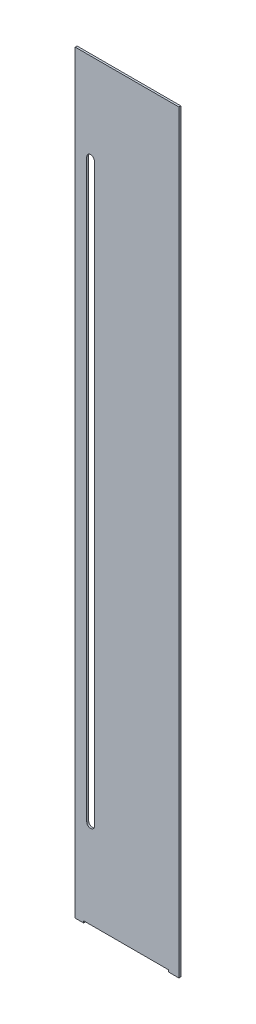
ISO-10303-21;
HEADER;
FILE_DESCRIPTION(('STEP AP214'),'2;1');
FILE_NAME('part.step','',(''),(''),'','','');
FILE_SCHEMA(('AUTOMOTIVE_DESIGN { 1 0 10303 214 1 1 1 1 }'));
ENDSEC;
DATA;
#1=APPLICATION_CONTEXT('core data for automotive mechanical design processes');
#2=APPLICATION_PROTOCOL_DEFINITION('international standard','automotive_design',2000,#1);
#3=PRODUCT_CONTEXT('',#1,'mechanical');
#4=PRODUCT('Part','Part','',(#3));
#5=PRODUCT_RELATED_PRODUCT_CATEGORY('part','',(#4));
#6=PRODUCT_DEFINITION_FORMATION('','',#4);
#7=PRODUCT_DEFINITION_CONTEXT('part definition',#1,'design');
#8=PRODUCT_DEFINITION('design','',#6,#7);
#9=PRODUCT_DEFINITION_SHAPE('','',#8);
#10=(LENGTH_UNIT() NAMED_UNIT(*) SI_UNIT(.MILLI.,.METRE.));
#11=(NAMED_UNIT(*) PLANE_ANGLE_UNIT() SI_UNIT($,.RADIAN.));
#12=(NAMED_UNIT(*) SI_UNIT($,.STERADIAN.) SOLID_ANGLE_UNIT());
#13=UNCERTAINTY_MEASURE_WITH_UNIT(LENGTH_MEASURE(1.E-05),#10,'distance_accuracy_value','');
#14=(GEOMETRIC_REPRESENTATION_CONTEXT(3) GLOBAL_UNCERTAINTY_ASSIGNED_CONTEXT((#13)) GLOBAL_UNIT_ASSIGNED_CONTEXT((#10,
#11,#12)) REPRESENTATION_CONTEXT('',''));
#15=CARTESIAN_POINT('',(0.,0.,0.));
#16=DIRECTION('',(0.,0.,1.));
#17=DIRECTION('',(1.,0.,0.));
#18=AXIS2_PLACEMENT_3D('',#15,#16,#17);
#19=CARTESIAN_POINT('',(-135.,-982.500000000002,5.));
#20=DIRECTION('',(0.,1.,0.));
#21=DIRECTION('',(0.,0.,1.));
#22=AXIS2_PLACEMENT_3D('',#19,#20,#21);
#23=PLANE('',#22);
#24=DIRECTION('',(1.,0.,0.));
#25=VECTOR('',#24,1.);
#26=CARTESIAN_POINT('',(-135.,-982.500000000002,0.));
#27=LINE('',#26,#25);
#28=CARTESIAN_POINT('',(-135.,-982.500000000002,0.));
#29=VERTEX_POINT('',#28);
#30=CARTESIAN_POINT('',(-113.,-982.500000000002,0.));
#31=VERTEX_POINT('',#30);
#32=EDGE_CURVE('E142',#29,#31,#27,.T.);
#33=ORIENTED_EDGE('',*,*,#32,.T.);
#34=DIRECTION('',(0.,0.,1.));
#35=VECTOR('',#34,1.);
#36=CARTESIAN_POINT('',(-113.,-982.500000000002,0.));
#37=LINE('',#36,#35);
#38=CARTESIAN_POINT('',(-113.,-982.500000000002,5.));
#39=VERTEX_POINT('',#38);
#40=EDGE_CURVE('E86',#31,#39,#37,.T.);
#41=ORIENTED_EDGE('',*,*,#40,.T.);
#42=DIRECTION('',(1.,0.,0.));
#43=VECTOR('',#42,1.);
#44=CARTESIAN_POINT('',(-135.,-982.500000000002,5.));
#45=LINE('',#44,#43);
#46=CARTESIAN_POINT('',(-135.,-982.500000000002,5.));
#47=VERTEX_POINT('',#46);
#48=EDGE_CURVE('E152',#47,#39,#45,.T.);
#49=ORIENTED_EDGE('',*,*,#48,.F.);
#50=DIRECTION('',(0.,0.,-1.));
#51=VECTOR('',#50,1.);
#52=CARTESIAN_POINT('',(-135.,-982.500000000002,5.));
#53=LINE('',#52,#51);
#54=EDGE_CURVE('E151',#47,#29,#53,.T.);
#55=ORIENTED_EDGE('',*,*,#54,.T.);
#56=EDGE_LOOP('',(#33,#41,#49,#55));
#57=FACE_BOUND('',#56,.T.);
#58=ADVANCED_FACE('F32',(#57),#23,.F.);
#59=CARTESIAN_POINT('',(135.,982.499999999998,5.));
#60=DIRECTION('',(-1.,0.,0.));
#61=DIRECTION('',(0.,-1.,0.));
#62=AXIS2_PLACEMENT_3D('',#59,#60,#61);
#63=PLANE('',#62);
#64=DIRECTION('',(0.,1.,0.));
#65=VECTOR('',#64,1.);
#66=CARTESIAN_POINT('',(135.,982.499999999998,0.));
#67=LINE('',#66,#65);
#68=CARTESIAN_POINT('',(135.,-982.500000000002,0.));
#69=VERTEX_POINT('',#68);
#70=CARTESIAN_POINT('',(135.,982.499999999998,0.));
#71=VERTEX_POINT('',#70);
#72=EDGE_CURVE('E148',#69,#71,#67,.T.);
#73=ORIENTED_EDGE('',*,*,#72,.T.);
#74=DIRECTION('',(0.,0.,-1.));
#75=VECTOR('',#74,1.);
#76=CARTESIAN_POINT('',(135.,982.499999999998,5.));
#77=LINE('',#76,#75);
#78=CARTESIAN_POINT('',(135.,982.499999999998,5.));
#79=VERTEX_POINT('',#78);
#80=EDGE_CURVE('E11',#79,#71,#77,.T.);
#81=ORIENTED_EDGE('',*,*,#80,.F.);
#82=DIRECTION('',(0.,1.,0.));
#83=VECTOR('',#82,1.);
#84=CARTESIAN_POINT('',(135.,982.499999999998,5.));
#85=LINE('',#84,#83);
#86=CARTESIAN_POINT('',(135.,-982.500000000002,5.));
#87=VERTEX_POINT('',#86);
#88=EDGE_CURVE('E150',#87,#79,#85,.T.);
#89=ORIENTED_EDGE('',*,*,#88,.F.);
#90=DIRECTION('',(0.,0.,-1.));
#91=VECTOR('',#90,1.);
#92=CARTESIAN_POINT('',(135.,-982.500000000002,5.));
#93=LINE('',#92,#91);
#94=EDGE_CURVE('E136',#87,#69,#93,.T.);
#95=ORIENTED_EDGE('',*,*,#94,.T.);
#96=EDGE_LOOP('',(#73,#81,#89,#95));
#97=FACE_BOUND('',#96,.T.);
#98=ADVANCED_FACE('F34',(#97),#63,.F.);
#99=CARTESIAN_POINT('',(-135.,982.499999999998,5.));
#100=DIRECTION('',(0.,-1.,0.));
#101=DIRECTION('',(1.,0.,0.));
#102=AXIS2_PLACEMENT_3D('',#99,#100,#101);
#103=PLANE('',#102);
#104=DIRECTION('',(-1.,0.,0.));
#105=VECTOR('',#104,1.);
#106=CARTESIAN_POINT('',(-135.,982.499999999998,0.));
#107=LINE('',#106,#105);
#108=CARTESIAN_POINT('',(-135.,982.499999999998,0.));
#109=VERTEX_POINT('',#108);
#110=EDGE_CURVE('E157',#71,#109,#107,.T.);
#111=ORIENTED_EDGE('',*,*,#110,.T.);
#112=DIRECTION('',(0.,0.,-1.));
#113=VECTOR('',#112,1.);
#114=CARTESIAN_POINT('',(-135.,982.499999999998,5.));
#115=LINE('',#114,#113);
#116=CARTESIAN_POINT('',(-135.,982.499999999998,5.));
#117=VERTEX_POINT('',#116);
#118=EDGE_CURVE('E41',#117,#109,#115,.T.);
#119=ORIENTED_EDGE('',*,*,#118,.F.);
#120=DIRECTION('',(-1.,0.,0.));
#121=VECTOR('',#120,1.);
#122=CARTESIAN_POINT('',(-135.,982.499999999998,5.));
#123=LINE('',#122,#121);
#124=EDGE_CURVE('E202',#79,#117,#123,.T.);
#125=ORIENTED_EDGE('',*,*,#124,.F.);
#126=ORIENTED_EDGE('',*,*,#80,.T.);
#127=EDGE_LOOP('',(#111,#119,#125,#126));
#128=FACE_BOUND('',#127,.T.);
#129=ADVANCED_FACE('F219',(#128),#103,.F.);
#130=CARTESIAN_POINT('',(-135.,982.499999999998,5.));
#131=DIRECTION('',(1.,0.,0.));
#132=DIRECTION('',(0.,1.,0.));
#133=AXIS2_PLACEMENT_3D('',#130,#131,#132);
#134=PLANE('',#133);
#135=DIRECTION('',(0.,-1.,0.));
#136=VECTOR('',#135,1.);
#137=CARTESIAN_POINT('',(-135.,982.499999999998,0.));
#138=LINE('',#137,#136);
#139=EDGE_CURVE('E143',#109,#29,#138,.T.);
#140=ORIENTED_EDGE('',*,*,#139,.T.);
#141=ORIENTED_EDGE('',*,*,#54,.F.);
#142=DIRECTION('',(0.,-1.,0.));
#143=VECTOR('',#142,1.);
#144=CARTESIAN_POINT('',(-135.,982.499999999998,5.));
#145=LINE('',#144,#143);
#146=EDGE_CURVE('E203',#117,#47,#145,.T.);
#147=ORIENTED_EDGE('',*,*,#146,.F.);
#148=ORIENTED_EDGE('',*,*,#118,.T.);
#149=EDGE_LOOP('',(#140,#141,#147,#148));
#150=FACE_BOUND('',#149,.T.);
#151=ADVANCED_FACE('F216',(#150),#134,.F.);
#152=CARTESIAN_POINT('',(108.,-982.500000000002,5.));
#153=VERTEX_POINT('',#152);
#154=EDGE_CURVE('E204',#153,#87,#45,.T.);
#155=ORIENTED_EDGE('',*,*,#154,.F.);
#156=DIRECTION('',(0.,0.,1.));
#157=VECTOR('',#156,1.);
#158=CARTESIAN_POINT('',(108.,-982.500000000002,0.));
#159=LINE('',#158,#157);
#160=CARTESIAN_POINT('',(108.,-982.500000000002,0.));
#161=VERTEX_POINT('',#160);
#162=EDGE_CURVE('E138',#161,#153,#159,.T.);
#163=ORIENTED_EDGE('',*,*,#162,.F.);
#164=EDGE_CURVE('E132',#161,#69,#27,.T.);
#165=ORIENTED_EDGE('',*,*,#164,.T.);
#166=ORIENTED_EDGE('',*,*,#94,.F.);
#167=EDGE_LOOP('',(#155,#163,#165,#166));
#168=FACE_BOUND('',#167,.T.);
#169=ADVANCED_FACE('F135',(#168),#23,.F.);
#170=CARTESIAN_POINT('',(0.,0.,5.));
#171=DIRECTION('',(0.,0.,1.));
#172=DIRECTION('',(1.,0.,0.));
#173=AXIS2_PLACEMENT_3D('',#170,#171,#172);
#174=PLANE('',#173);
#175=CARTESIAN_POINT('',(-94.9999999999998,750.,5.));
#176=DIRECTION('',(0.,0.,1.));
#177=DIRECTION('',(1.,0.,0.));
#178=AXIS2_PLACEMENT_3D('',#175,#176,#177);
#179=CIRCLE('',#178,10.0000000000002);
#180=CARTESIAN_POINT('',(-84.9999999999997,750.,5.));
#181=VERTEX_POINT('',#180);
#182=CARTESIAN_POINT('',(-105.,750.,5.));
#183=VERTEX_POINT('',#182);
#184=EDGE_CURVE('E36',#181,#183,#179,.T.);
#185=ORIENTED_EDGE('',*,*,#184,.F.);
#186=DIRECTION('',(0.,1.,0.));
#187=VECTOR('',#186,1.);
#188=CARTESIAN_POINT('',(-84.9999999999997,750.,5.));
#189=LINE('',#188,#187);
#190=CARTESIAN_POINT('',(-84.9999999999997,-750.,5.));
#191=VERTEX_POINT('',#190);
#192=EDGE_CURVE('E77',#191,#181,#189,.T.);
#193=ORIENTED_EDGE('',*,*,#192,.F.);
#194=CARTESIAN_POINT('',(-94.9999999999998,-750.,5.));
#195=DIRECTION('',(0.,0.,1.));
#196=DIRECTION('',(1.,0.,0.));
#197=AXIS2_PLACEMENT_3D('',#194,#195,#196);
#198=CIRCLE('',#197,10.0000000000002);
#199=CARTESIAN_POINT('',(-105.,-750.,5.));
#200=VERTEX_POINT('',#199);
#201=EDGE_CURVE('E174',#200,#191,#198,.T.);
#202=ORIENTED_EDGE('',*,*,#201,.F.);
#203=DIRECTION('',(0.,1.,0.));
#204=VECTOR('',#203,1.);
#205=CARTESIAN_POINT('',(-105.,750.,5.));
#206=LINE('',#205,#204);
#207=EDGE_CURVE('E172',#183,#200,#206,.F.);
#208=ORIENTED_EDGE('',*,*,#207,.F.);
#209=EDGE_LOOP('',(#185,#193,#202,#208));
#210=FACE_BOUND('',#209,.T.);
#211=DIRECTION('',(0.,-1.,0.));
#212=VECTOR('',#211,1.);
#213=CARTESIAN_POINT('',(-113.,0.,5.));
#214=LINE('',#213,#212);
#215=CARTESIAN_POINT('',(-113.,-977.500000000002,5.));
#216=VERTEX_POINT('',#215);
#217=EDGE_CURVE('E158',#216,#39,#214,.T.);
#218=ORIENTED_EDGE('',*,*,#217,.F.);
#219=DIRECTION('',(-1.,0.,0.));
#220=VECTOR('',#219,1.);
#221=CARTESIAN_POINT('',(0.,-977.500000000002,5.));
#222=LINE('',#221,#220);
#223=CARTESIAN_POINT('',(108.,-977.500000000002,5.));
#224=VERTEX_POINT('',#223);
#225=EDGE_CURVE('E161',#224,#216,#222,.T.);
#226=ORIENTED_EDGE('',*,*,#225,.F.);
#227=DIRECTION('',(0.,1.,0.));
#228=VECTOR('',#227,1.);
#229=CARTESIAN_POINT('',(108.,0.,5.));
#230=LINE('',#229,#228);
#231=EDGE_CURVE('E193',#153,#224,#230,.T.);
#232=ORIENTED_EDGE('',*,*,#231,.F.);
#233=ORIENTED_EDGE('',*,*,#154,.T.);
#234=ORIENTED_EDGE('',*,*,#88,.T.);
#235=ORIENTED_EDGE('',*,*,#124,.T.);
#236=ORIENTED_EDGE('',*,*,#146,.T.);
#237=ORIENTED_EDGE('',*,*,#48,.T.);
#238=EDGE_LOOP('',(#218,#226,#232,#233,#234,#235,#236,#237));
#239=FACE_BOUND('',#238,.T.);
#240=ADVANCED_FACE('F212',(#210,#239),#174,.T.);
#241=CARTESIAN_POINT('',(0.,0.,0.));
#242=DIRECTION('',(0.,0.,1.));
#243=DIRECTION('',(1.,0.,0.));
#244=AXIS2_PLACEMENT_3D('',#241,#242,#243);
#245=PLANE('',#244);
#246=DIRECTION('',(0.,1.,0.));
#247=VECTOR('',#246,1.);
#248=CARTESIAN_POINT('',(-84.9999999999997,750.,0.));
#249=LINE('',#248,#247);
#250=CARTESIAN_POINT('',(-84.9999999999997,-750.,0.));
#251=VERTEX_POINT('',#250);
#252=CARTESIAN_POINT('',(-84.9999999999997,750.,0.));
#253=VERTEX_POINT('',#252);
#254=EDGE_CURVE('E345',#251,#253,#249,.T.);
#255=ORIENTED_EDGE('',*,*,#254,.T.);
#256=CARTESIAN_POINT('',(-94.9999999999998,750.,0.));
#257=DIRECTION('',(0.,0.,1.));
#258=DIRECTION('',(1.,0.,0.));
#259=AXIS2_PLACEMENT_3D('',#256,#257,#258);
#260=CIRCLE('',#259,10.0000000000002);
#261=CARTESIAN_POINT('',(-105.,750.,0.));
#262=VERTEX_POINT('',#261);
#263=EDGE_CURVE('E352',#253,#262,#260,.T.);
#264=ORIENTED_EDGE('',*,*,#263,.T.);
#265=DIRECTION('',(0.,-1.,0.));
#266=VECTOR('',#265,1.);
#267=CARTESIAN_POINT('',(-105.,750.,0.));
#268=LINE('',#267,#266);
#269=CARTESIAN_POINT('',(-105.,-750.,0.));
#270=VERTEX_POINT('',#269);
#271=EDGE_CURVE('E349',#262,#270,#268,.T.);
#272=ORIENTED_EDGE('',*,*,#271,.T.);
#273=CARTESIAN_POINT('',(-94.9999999999998,-750.,0.));
#274=DIRECTION('',(0.,0.,1.));
#275=DIRECTION('',(1.,0.,0.));
#276=AXIS2_PLACEMENT_3D('',#273,#274,#275);
#277=CIRCLE('',#276,10.0000000000002);
#278=EDGE_CURVE('E58',#270,#251,#277,.T.);
#279=ORIENTED_EDGE('',*,*,#278,.T.);
#280=EDGE_LOOP('',(#255,#264,#272,#279));
#281=FACE_BOUND('',#280,.T.);
#282=DIRECTION('',(-1.,0.,0.));
#283=VECTOR('',#282,1.);
#284=CARTESIAN_POINT('',(-113.,-977.500000000002,0.));
#285=LINE('',#284,#283);
#286=CARTESIAN_POINT('',(108.,-977.500000000002,0.));
#287=VERTEX_POINT('',#286);
#288=CARTESIAN_POINT('',(-113.,-977.500000000002,0.));
#289=VERTEX_POINT('',#288);
#290=EDGE_CURVE('E183',#287,#289,#285,.T.);
#291=ORIENTED_EDGE('',*,*,#290,.T.);
#292=DIRECTION('',(0.,-1.,0.));
#293=VECTOR('',#292,1.);
#294=CARTESIAN_POINT('',(-113.,-982.500000000002,0.));
#295=LINE('',#294,#293);
#296=EDGE_CURVE('E176',#289,#31,#295,.T.);
#297=ORIENTED_EDGE('',*,*,#296,.T.);
#298=ORIENTED_EDGE('',*,*,#32,.F.);
#299=ORIENTED_EDGE('',*,*,#139,.F.);
#300=ORIENTED_EDGE('',*,*,#110,.F.);
#301=ORIENTED_EDGE('',*,*,#72,.F.);
#302=ORIENTED_EDGE('',*,*,#164,.F.);
#303=DIRECTION('',(0.,1.,0.));
#304=VECTOR('',#303,1.);
#305=CARTESIAN_POINT('',(108.,-982.500000000002,0.));
#306=LINE('',#305,#304);
#307=EDGE_CURVE('E180',#161,#287,#306,.T.);
#308=ORIENTED_EDGE('',*,*,#307,.T.);
#309=EDGE_LOOP('',(#291,#297,#298,#299,#300,#301,#302,#308));
#310=FACE_BOUND('',#309,.T.);
#311=ADVANCED_FACE('F155',(#281,#310),#245,.F.);
#312=CARTESIAN_POINT('',(-113.,-982.500000000002,0.));
#313=DIRECTION('',(-1.,0.,0.));
#314=DIRECTION('',(0.,0.,1.));
#315=AXIS2_PLACEMENT_3D('',#312,#313,#314);
#316=PLANE('',#315);
#317=ORIENTED_EDGE('',*,*,#217,.T.);
#318=ORIENTED_EDGE('',*,*,#40,.F.);
#319=ORIENTED_EDGE('',*,*,#296,.F.);
#320=DIRECTION('',(0.,0.,1.));
#321=VECTOR('',#320,1.);
#322=CARTESIAN_POINT('',(-113.,-977.500000000002,0.));
#323=LINE('',#322,#321);
#324=EDGE_CURVE('E190',#289,#216,#323,.T.);
#325=ORIENTED_EDGE('',*,*,#324,.T.);
#326=EDGE_LOOP('',(#317,#318,#319,#325));
#327=FACE_BOUND('',#326,.T.);
#328=ADVANCED_FACE('F240',(#327),#316,.F.);
#329=CARTESIAN_POINT('',(-113.,-977.500000000002,0.));
#330=DIRECTION('',(0.,1.,0.));
#331=DIRECTION('',(0.,0.,1.));
#332=AXIS2_PLACEMENT_3D('',#329,#330,#331);
#333=PLANE('',#332);
#334=ORIENTED_EDGE('',*,*,#225,.T.);
#335=ORIENTED_EDGE('',*,*,#324,.F.);
#336=ORIENTED_EDGE('',*,*,#290,.F.);
#337=DIRECTION('',(0.,0.,1.));
#338=VECTOR('',#337,1.);
#339=CARTESIAN_POINT('',(108.,-977.500000000002,0.));
#340=LINE('',#339,#338);
#341=EDGE_CURVE('E194',#287,#224,#340,.T.);
#342=ORIENTED_EDGE('',*,*,#341,.T.);
#343=EDGE_LOOP('',(#334,#335,#336,#342));
#344=FACE_BOUND('',#343,.T.);
#345=ADVANCED_FACE('F245',(#344),#333,.F.);
#346=CARTESIAN_POINT('',(108.,-982.500000000002,0.));
#347=DIRECTION('',(1.,0.,0.));
#348=DIRECTION('',(0.,0.,-1.));
#349=AXIS2_PLACEMENT_3D('',#346,#347,#348);
#350=PLANE('',#349);
#351=ORIENTED_EDGE('',*,*,#231,.T.);
#352=ORIENTED_EDGE('',*,*,#341,.F.);
#353=ORIENTED_EDGE('',*,*,#307,.F.);
#354=ORIENTED_EDGE('',*,*,#162,.T.);
#355=EDGE_LOOP('',(#351,#352,#353,#354));
#356=FACE_BOUND('',#355,.T.);
#357=ADVANCED_FACE('F246',(#356),#350,.F.);
#358=CARTESIAN_POINT('',(-94.9999999999998,750.,0.));
#359=DIRECTION('',(0.,0.,1.));
#360=DIRECTION('',(1.,0.,0.));
#361=AXIS2_PLACEMENT_3D('',#358,#359,#360);
#362=CYLINDRICAL_SURFACE('',#361,10.0000000000002);
#363=ORIENTED_EDGE('',*,*,#184,.T.);
#364=DIRECTION('',(0.,0.,1.));
#365=VECTOR('',#364,1.);
#366=CARTESIAN_POINT('',(-105.,750.,0.));
#367=LINE('',#366,#365);
#368=EDGE_CURVE('E49',#262,#183,#367,.T.);
#369=ORIENTED_EDGE('',*,*,#368,.F.);
#370=ORIENTED_EDGE('',*,*,#263,.F.);
#371=DIRECTION('',(0.,0.,1.));
#372=VECTOR('',#371,1.);
#373=CARTESIAN_POINT('',(-84.9999999999997,750.,0.));
#374=LINE('',#373,#372);
#375=EDGE_CURVE('E175',#253,#181,#374,.T.);
#376=ORIENTED_EDGE('',*,*,#375,.T.);
#377=EDGE_LOOP('',(#363,#369,#370,#376));
#378=FACE_BOUND('',#377,.T.);
#379=ADVANCED_FACE('F249',(#378),#362,.F.);
#380=CARTESIAN_POINT('',(-84.9999999999997,750.,0.));
#381=DIRECTION('',(1.,0.,0.));
#382=DIRECTION('',(0.,0.,-1.));
#383=AXIS2_PLACEMENT_3D('',#380,#381,#382);
#384=PLANE('',#383);
#385=ORIENTED_EDGE('',*,*,#192,.T.);
#386=ORIENTED_EDGE('',*,*,#375,.F.);
#387=ORIENTED_EDGE('',*,*,#254,.F.);
#388=DIRECTION('',(0.,0.,1.));
#389=VECTOR('',#388,1.);
#390=CARTESIAN_POINT('',(-84.9999999999997,-750.,0.));
#391=LINE('',#390,#389);
#392=EDGE_CURVE('E342',#251,#191,#391,.T.);
#393=ORIENTED_EDGE('',*,*,#392,.T.);
#394=EDGE_LOOP('',(#385,#386,#387,#393));
#395=FACE_BOUND('',#394,.T.);
#396=ADVANCED_FACE('F256',(#395),#384,.F.);
#397=CARTESIAN_POINT('',(-94.9999999999998,-750.,0.));
#398=DIRECTION('',(0.,0.,1.));
#399=DIRECTION('',(1.,0.,0.));
#400=AXIS2_PLACEMENT_3D('',#397,#398,#399);
#401=CYLINDRICAL_SURFACE('',#400,10.0000000000002);
#402=ORIENTED_EDGE('',*,*,#201,.T.);
#403=ORIENTED_EDGE('',*,*,#392,.F.);
#404=ORIENTED_EDGE('',*,*,#278,.F.);
#405=DIRECTION('',(0.,0.,1.));
#406=VECTOR('',#405,1.);
#407=CARTESIAN_POINT('',(-105.,-750.,0.));
#408=LINE('',#407,#406);
#409=EDGE_CURVE('E186',#270,#200,#408,.T.);
#410=ORIENTED_EDGE('',*,*,#409,.T.);
#411=EDGE_LOOP('',(#402,#403,#404,#410));
#412=FACE_BOUND('',#411,.T.);
#413=ADVANCED_FACE('F260',(#412),#401,.F.);
#414=CARTESIAN_POINT('',(-105.,750.,0.));
#415=DIRECTION('',(-1.,0.,0.));
#416=DIRECTION('',(0.,0.,1.));
#417=AXIS2_PLACEMENT_3D('',#414,#415,#416);
#418=PLANE('',#417);
#419=ORIENTED_EDGE('',*,*,#207,.T.);
#420=ORIENTED_EDGE('',*,*,#409,.F.);
#421=ORIENTED_EDGE('',*,*,#271,.F.);
#422=ORIENTED_EDGE('',*,*,#368,.T.);
#423=EDGE_LOOP('',(#419,#420,#421,#422));
#424=FACE_BOUND('',#423,.T.);
#425=ADVANCED_FACE('F257',(#424),#418,.F.);
#426=CLOSED_SHELL('',(#58,#98,#129,#151,#169,#240,#311,#328,#345,#357,#379,#396,#413,#425));
#427=MANIFOLD_SOLID_BREP('B2',#426);
#428=ADVANCED_BREP_SHAPE_REPRESENTATION('',(#18,#427),#14);
#429=SHAPE_DEFINITION_REPRESENTATION(#9,#428);
ENDSEC;
END-ISO-10303-21;
